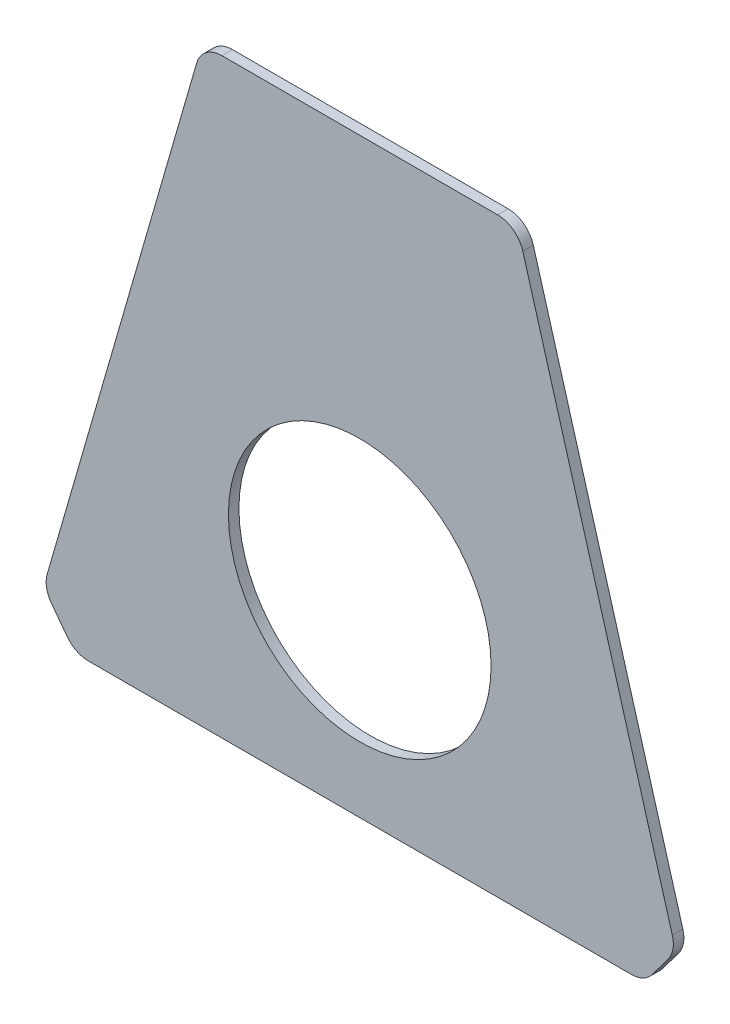
ISO-10303-21;
HEADER;
FILE_DESCRIPTION(('STEP AP214'),'2;1');
FILE_NAME('part.step','',(''),(''),'','','');
FILE_SCHEMA(('AUTOMOTIVE_DESIGN { 1 0 10303 214 1 1 1 1 }'));
ENDSEC;
DATA;
#1=APPLICATION_CONTEXT('core data for automotive mechanical design processes');
#2=APPLICATION_PROTOCOL_DEFINITION('international standard','automotive_design',2000,#1);
#3=PRODUCT_CONTEXT('',#1,'mechanical');
#4=PRODUCT('Part','Part','',(#3));
#5=PRODUCT_RELATED_PRODUCT_CATEGORY('part','',(#4));
#6=PRODUCT_DEFINITION_FORMATION('','',#4);
#7=PRODUCT_DEFINITION_CONTEXT('part definition',#1,'design');
#8=PRODUCT_DEFINITION('design','',#6,#7);
#9=PRODUCT_DEFINITION_SHAPE('','',#8);
#10=(LENGTH_UNIT() NAMED_UNIT(*) SI_UNIT(.MILLI.,.METRE.));
#11=(NAMED_UNIT(*) PLANE_ANGLE_UNIT() SI_UNIT($,.RADIAN.));
#12=(NAMED_UNIT(*) SI_UNIT($,.STERADIAN.) SOLID_ANGLE_UNIT());
#13=UNCERTAINTY_MEASURE_WITH_UNIT(LENGTH_MEASURE(1.E-05),#10,'distance_accuracy_value','');
#14=(GEOMETRIC_REPRESENTATION_CONTEXT(3) GLOBAL_UNCERTAINTY_ASSIGNED_CONTEXT((#13)) GLOBAL_UNIT_ASSIGNED_CONTEXT((#10,
#11,#12)) REPRESENTATION_CONTEXT('',''));
#15=CARTESIAN_POINT('',(0.,0.,0.));
#16=DIRECTION('',(0.,0.,1.));
#17=DIRECTION('',(1.,0.,0.));
#18=AXIS2_PLACEMENT_3D('',#15,#16,#17);
#19=CARTESIAN_POINT('',(-30.5782122406627,-53.0938116022941,1.016));
#20=DIRECTION('',(0.799230771686367,0.601024270383163,0.));
#21=DIRECTION('',(0.,0.,1.));
#22=AXIS2_PLACEMENT_3D('',#19,#20,#21);
#23=PLANE('',#22);
#24=DIRECTION('',(-0.601024270383163,0.799230771686367,0.));
#25=VECTOR('',#24,1.);
#26=CARTESIAN_POINT('',(-30.5782122406627,-53.0938116022941,1.016));
#27=LINE('',#26,#25);
#28=CARTESIAN_POINT('',(-29.8161332173908,-54.1072099555208,1.016));
#29=VERTEX_POINT('',#28);
#30=CARTESIAN_POINT('',(-28.290023733414,-56.1366016467733,1.016));
#31=VERTEX_POINT('',#30);
#32=EDGE_CURVE('E140',#29,#31,#27,.F.);
#33=ORIENTED_EDGE('',*,*,#32,.F.);
#34=DIRECTION('',(0.,0.,1.));
#35=VECTOR('',#34,1.);
#36=CARTESIAN_POINT('',(-29.8161332173908,-54.1072099555208,0.));
#37=LINE('',#36,#35);
#38=CARTESIAN_POINT('',(-29.8161332173908,-54.1072099555208,0.));
#39=VERTEX_POINT('',#38);
#40=EDGE_CURVE('E200',#29,#39,#37,.F.);
#41=ORIENTED_EDGE('',*,*,#40,.T.);
#42=DIRECTION('',(0.601024270383163,-0.799230771686367,0.));
#43=VECTOR('',#42,1.);
#44=CARTESIAN_POINT('',(-45.0364282386178,-33.8675478743966,0.));
#45=LINE('',#44,#43);
#46=CARTESIAN_POINT('',(-28.290023733414,-56.1366016467733,0.));
#47=VERTEX_POINT('',#46);
#48=EDGE_CURVE('E164',#47,#39,#45,.F.);
#49=ORIENTED_EDGE('',*,*,#48,.F.);
#50=DIRECTION('',(0.,0.,-1.));
#51=VECTOR('',#50,1.);
#52=CARTESIAN_POINT('',(-28.290023733414,-56.1366016467733,1.016));
#53=LINE('',#52,#51);
#54=EDGE_CURVE('E198',#47,#31,#53,.F.);
#55=ORIENTED_EDGE('',*,*,#54,.T.);
#56=EDGE_LOOP('',(#33,#41,#49,#55));
#57=FACE_BOUND('',#56,.T.);
#58=ADVANCED_FACE('F43',(#57),#23,.F.);
#59=CARTESIAN_POINT('',(30.5782122406627,-53.0938116022941,1.016));
#60=DIRECTION('',(-0.799230771686367,0.601024270383163,0.));
#61=DIRECTION('',(0.,0.,-1.));
#62=AXIS2_PLACEMENT_3D('',#59,#60,#61);
#63=PLANE('',#62);
#64=DIRECTION('',(-0.601024270383163,-0.799230771686367,0.));
#65=VECTOR('',#64,1.);
#66=CARTESIAN_POINT('',(30.5782122406627,-53.0938116022941,1.016));
#67=LINE('',#66,#65);
#68=CARTESIAN_POINT('',(28.290023733414,-56.1366016467733,1.016));
#69=VERTEX_POINT('',#68);
#70=CARTESIAN_POINT('',(29.8161332173908,-54.1072099555208,1.016));
#71=VERTEX_POINT('',#70);
#72=EDGE_CURVE('E216',#69,#71,#67,.F.);
#73=ORIENTED_EDGE('',*,*,#72,.F.);
#74=DIRECTION('',(0.,0.,1.));
#75=VECTOR('',#74,1.);
#76=CARTESIAN_POINT('',(28.290023733414,-56.1366016467733,0.));
#77=LINE('',#76,#75);
#78=CARTESIAN_POINT('',(28.290023733414,-56.1366016467733,0.));
#79=VERTEX_POINT('',#78);
#80=EDGE_CURVE('E177',#69,#79,#77,.F.);
#81=ORIENTED_EDGE('',*,*,#80,.T.);
#82=DIRECTION('',(0.601024270383163,0.799230771686367,0.));
#83=VECTOR('',#82,1.);
#84=CARTESIAN_POINT('',(45.0364282386178,-33.8675478743966,0.));
#85=LINE('',#84,#83);
#86=CARTESIAN_POINT('',(29.8161332173908,-54.1072099555208,0.));
#87=VERTEX_POINT('',#86);
#88=EDGE_CURVE('E243',#87,#79,#85,.F.);
#89=ORIENTED_EDGE('',*,*,#88,.F.);
#90=DIRECTION('',(0.,0.,-1.));
#91=VECTOR('',#90,1.);
#92=CARTESIAN_POINT('',(29.8161332173908,-54.1072099555208,1.016));
#93=LINE('',#92,#91);
#94=EDGE_CURVE('E175',#87,#71,#93,.F.);
#95=ORIENTED_EDGE('',*,*,#94,.T.);
#96=EDGE_LOOP('',(#73,#81,#89,#95));
#97=FACE_BOUND('',#96,.T.);
#98=ADVANCED_FACE('F262',(#97),#63,.F.);
#99=CARTESIAN_POINT('',(-15.24,0.,1.016));
#100=DIRECTION('',(0.960714182841142,-0.277539652820774,0.));
#101=DIRECTION('',(0.277539652820774,0.960714182841142,0.));
#102=AXIS2_PLACEMENT_3D('',#99,#100,#101);
#103=PLANE('',#102);
#104=DIRECTION('',(-0.277539652820774,-0.960714182841142,0.));
#105=VECTOR('',#104,1.);
#106=CARTESIAN_POINT('',(-15.24,0.,0.));
#107=LINE('',#106,#105);
#108=CARTESIAN_POINT('',(-15.7701253480857,-1.83504928183523,0.));
#109=VERTEX_POINT('',#108);
#110=CARTESIAN_POINT('',(-30.2263010817239,-51.8756575905828,0.));
#111=VERTEX_POINT('',#110);
#112=EDGE_CURVE('E223',#109,#111,#107,.T.);
#113=ORIENTED_EDGE('',*,*,#112,.T.);
#114=DIRECTION('',(0.,0.,-1.));
#115=VECTOR('',#114,1.);
#116=CARTESIAN_POINT('',(-30.2263010817239,-51.8756575905828,1.016));
#117=LINE('',#116,#115);
#118=CARTESIAN_POINT('',(-30.2263010817239,-51.8756575905828,1.016));
#119=VERTEX_POINT('',#118);
#120=EDGE_CURVE('E195',#111,#119,#117,.F.);
#121=ORIENTED_EDGE('',*,*,#120,.T.);
#122=DIRECTION('',(-0.277539652820774,-0.960714182841142,0.));
#123=VECTOR('',#122,1.);
#124=CARTESIAN_POINT('',(-15.24,0.,1.016));
#125=LINE('',#124,#123);
#126=CARTESIAN_POINT('',(-15.7701253480857,-1.83504928183523,1.016));
#127=VERTEX_POINT('',#126);
#128=EDGE_CURVE('E157',#127,#119,#125,.T.);
#129=ORIENTED_EDGE('',*,*,#128,.F.);
#130=DIRECTION('',(0.,0.,-1.));
#131=VECTOR('',#130,1.);
#132=CARTESIAN_POINT('',(-15.7701253480857,-1.83504928183523,1.016));
#133=LINE('',#132,#131);
#134=EDGE_CURVE('E192',#127,#109,#133,.T.);
#135=ORIENTED_EDGE('',*,*,#134,.T.);
#136=EDGE_LOOP('',(#113,#121,#129,#135));
#137=FACE_BOUND('',#136,.T.);
#138=ADVANCED_FACE('F222',(#137),#103,.F.);
#139=CARTESIAN_POINT('',(31.75,-57.15,1.016));
#140=DIRECTION('',(0.,1.,0.));
#141=DIRECTION('',(0.,0.,1.));
#142=AXIS2_PLACEMENT_3D('',#139,#140,#141);
#143=PLANE('',#142);
#144=DIRECTION('',(1.,0.,0.));
#145=VECTOR('',#144,1.);
#146=CARTESIAN_POINT('',(31.75,-57.15,0.));
#147=LINE('',#146,#145);
#148=CARTESIAN_POINT('',(-26.2599775733307,-57.15,0.));
#149=VERTEX_POINT('',#148);
#150=CARTESIAN_POINT('',(26.2599775733307,-57.15,0.));
#151=VERTEX_POINT('',#150);
#152=EDGE_CURVE('E229',#149,#151,#147,.T.);
#153=ORIENTED_EDGE('',*,*,#152,.T.);
#154=DIRECTION('',(0.,0.,-1.));
#155=VECTOR('',#154,1.);
#156=CARTESIAN_POINT('',(26.2599775733307,-57.15,1.016));
#157=LINE('',#156,#155);
#158=CARTESIAN_POINT('',(26.2599775733307,-57.15,1.016));
#159=VERTEX_POINT('',#158);
#160=EDGE_CURVE('E155',#151,#159,#157,.F.);
#161=ORIENTED_EDGE('',*,*,#160,.T.);
#162=DIRECTION('',(1.,0.,0.));
#163=VECTOR('',#162,1.);
#164=CARTESIAN_POINT('',(31.75,-57.15,1.016));
#165=LINE('',#164,#163);
#166=CARTESIAN_POINT('',(-26.2599775733307,-57.15,1.016));
#167=VERTEX_POINT('',#166);
#168=EDGE_CURVE('E138',#167,#159,#165,.T.);
#169=ORIENTED_EDGE('',*,*,#168,.F.);
#170=DIRECTION('',(0.,0.,1.));
#171=VECTOR('',#170,1.);
#172=CARTESIAN_POINT('',(-26.2599775733307,-57.15,0.));
#173=LINE('',#172,#171);
#174=EDGE_CURVE('E152',#167,#149,#173,.F.);
#175=ORIENTED_EDGE('',*,*,#174,.T.);
#176=EDGE_LOOP('',(#153,#161,#169,#175));
#177=FACE_BOUND('',#176,.T.);
#178=ADVANCED_FACE('F151',(#177),#143,.F.);
#179=CARTESIAN_POINT('',(15.24,0.,1.016));
#180=DIRECTION('',(-0.960714182841142,-0.277539652820774,0.));
#181=DIRECTION('',(0.277539652820774,-0.960714182841142,0.));
#182=AXIS2_PLACEMENT_3D('',#179,#180,#181);
#183=PLANE('',#182);
#184=DIRECTION('',(-0.277539652820774,0.960714182841142,0.));
#185=VECTOR('',#184,1.);
#186=CARTESIAN_POINT('',(15.24,0.,1.016));
#187=LINE('',#186,#185);
#188=CARTESIAN_POINT('',(30.2263010817239,-51.8756575905828,1.016));
#189=VERTEX_POINT('',#188);
#190=CARTESIAN_POINT('',(15.7701253480857,-1.83504928183523,1.016));
#191=VERTEX_POINT('',#190);
#192=EDGE_CURVE('E156',#189,#191,#187,.T.);
#193=ORIENTED_EDGE('',*,*,#192,.F.);
#194=DIRECTION('',(0.,0.,1.));
#195=VECTOR('',#194,1.);
#196=CARTESIAN_POINT('',(30.2263010817239,-51.8756575905828,0.));
#197=LINE('',#196,#195);
#198=CARTESIAN_POINT('',(30.2263010817239,-51.8756575905828,0.));
#199=VERTEX_POINT('',#198);
#200=EDGE_CURVE('E190',#189,#199,#197,.F.);
#201=ORIENTED_EDGE('',*,*,#200,.T.);
#202=DIRECTION('',(-0.277539652820774,0.960714182841142,0.));
#203=VECTOR('',#202,1.);
#204=CARTESIAN_POINT('',(15.24,0.,0.));
#205=LINE('',#204,#203);
#206=CARTESIAN_POINT('',(15.7701253480857,-1.83504928183523,0.));
#207=VERTEX_POINT('',#206);
#208=EDGE_CURVE('E232',#199,#207,#205,.T.);
#209=ORIENTED_EDGE('',*,*,#208,.T.);
#210=DIRECTION('',(0.,0.,-1.));
#211=VECTOR('',#210,1.);
#212=CARTESIAN_POINT('',(15.7701253480857,-1.83504928183523,1.016));
#213=LINE('',#212,#211);
#214=EDGE_CURVE('E188',#207,#191,#213,.F.);
#215=ORIENTED_EDGE('',*,*,#214,.T.);
#216=EDGE_LOOP('',(#193,#201,#209,#215));
#217=FACE_BOUND('',#216,.T.);
#218=ADVANCED_FACE('F257',(#217),#183,.F.);
#219=CARTESIAN_POINT('',(-15.24,0.,1.016));
#220=DIRECTION('',(0.,-1.,0.));
#221=DIRECTION('',(0.,0.,-1.));
#222=AXIS2_PLACEMENT_3D('',#219,#220,#221);
#223=PLANE('',#222);
#224=DIRECTION('',(-1.,0.,0.));
#225=VECTOR('',#224,1.);
#226=CARTESIAN_POINT('',(-15.24,0.,1.016));
#227=LINE('',#226,#225);
#228=CARTESIAN_POINT('',(13.3299113236692,0.,1.016));
#229=VERTEX_POINT('',#228);
#230=CARTESIAN_POINT('',(-13.3299113236692,0.,1.016));
#231=VERTEX_POINT('',#230);
#232=EDGE_CURVE('E207',#229,#231,#227,.T.);
#233=ORIENTED_EDGE('',*,*,#232,.F.);
#234=DIRECTION('',(0.,0.,-1.));
#235=VECTOR('',#234,1.);
#236=CARTESIAN_POINT('',(13.3299113236692,0.,1.016));
#237=LINE('',#236,#235);
#238=CARTESIAN_POINT('',(13.3299113236692,0.,0.));
#239=VERTEX_POINT('',#238);
#240=EDGE_CURVE('E13',#229,#239,#237,.T.);
#241=ORIENTED_EDGE('',*,*,#240,.T.);
#242=DIRECTION('',(-1.,0.,0.));
#243=VECTOR('',#242,1.);
#244=CARTESIAN_POINT('',(-15.24,0.,0.));
#245=LINE('',#244,#243);
#246=CARTESIAN_POINT('',(-13.3299113236692,0.,0.));
#247=VERTEX_POINT('',#246);
#248=EDGE_CURVE('E209',#239,#247,#245,.T.);
#249=ORIENTED_EDGE('',*,*,#248,.T.);
#250=DIRECTION('',(0.,0.,-1.));
#251=VECTOR('',#250,1.);
#252=CARTESIAN_POINT('',(-13.3299113236692,0.,1.016));
#253=LINE('',#252,#251);
#254=EDGE_CURVE('E51',#247,#231,#253,.F.);
#255=ORIENTED_EDGE('',*,*,#254,.T.);
#256=EDGE_LOOP('',(#233,#241,#249,#255));
#257=FACE_BOUND('',#256,.T.);
#258=ADVANCED_FACE('F206',(#257),#223,.F.);
#259=CARTESIAN_POINT('',(0.,0.,1.016));
#260=DIRECTION('',(0.,0.,-1.));
#261=DIRECTION('',(-1.,0.,0.));
#262=AXIS2_PLACEMENT_3D('',#259,#260,#261);
#263=PLANE('',#262);
#264=CARTESIAN_POINT('',(0.,-38.1,1.016));
#265=DIRECTION('',(0.,0.,1.));
#266=DIRECTION('',(1.,0.,0.));
#267=AXIS2_PLACEMENT_3D('',#264,#265,#266);
#268=CIRCLE('',#267,12.7);
#269=CARTESIAN_POINT('',(12.7,-38.1,1.016));
#270=VERTEX_POINT('',#269);
#271=EDGE_CURVE('E235',#270,#270,#268,.T.);
#272=ORIENTED_EDGE('',*,*,#271,.F.);
#273=EDGE_LOOP('',(#272));
#274=FACE_BOUND('',#273,.T.);
#275=ORIENTED_EDGE('',*,*,#168,.T.);
#276=CARTESIAN_POINT('',(26.2599775733307,-54.61,1.016));
#277=DIRECTION('',(0.,0.,-1.));
#278=DIRECTION('',(-1.,0.,0.));
#279=AXIS2_PLACEMENT_3D('',#276,#277,#278);
#280=CIRCLE('',#279,2.54);
#281=EDGE_CURVE('E173',#159,#69,#280,.F.);
#282=ORIENTED_EDGE('',*,*,#281,.T.);
#283=ORIENTED_EDGE('',*,*,#72,.T.);
#284=CARTESIAN_POINT('',(27.7860870573074,-52.5806083087476,1.016));
#285=DIRECTION('',(0.,0.,-1.));
#286=DIRECTION('',(-1.,0.,0.));
#287=AXIS2_PLACEMENT_3D('',#284,#285,#286);
#288=CIRCLE('',#287,2.54);
#289=EDGE_CURVE('E171',#71,#189,#288,.F.);
#290=ORIENTED_EDGE('',*,*,#289,.T.);
#291=ORIENTED_EDGE('',*,*,#192,.T.);
#292=CARTESIAN_POINT('',(13.3299113236692,-2.54,1.016));
#293=DIRECTION('',(0.,0.,-1.));
#294=DIRECTION('',(-1.,0.,0.));
#295=AXIS2_PLACEMENT_3D('',#292,#293,#294);
#296=CIRCLE('',#295,2.54);
#297=EDGE_CURVE('E145',#191,#229,#296,.F.);
#298=ORIENTED_EDGE('',*,*,#297,.T.);
#299=ORIENTED_EDGE('',*,*,#232,.T.);
#300=CARTESIAN_POINT('',(-13.3299113236692,-2.54,1.016));
#301=DIRECTION('',(0.,0.,-1.));
#302=DIRECTION('',(-1.,0.,0.));
#303=AXIS2_PLACEMENT_3D('',#300,#301,#302);
#304=CIRCLE('',#303,2.54);
#305=EDGE_CURVE('E162',#231,#127,#304,.F.);
#306=ORIENTED_EDGE('',*,*,#305,.T.);
#307=ORIENTED_EDGE('',*,*,#128,.T.);
#308=CARTESIAN_POINT('',(-27.7860870573074,-52.5806083087476,1.016));
#309=DIRECTION('',(0.,0.,-1.));
#310=DIRECTION('',(-1.,0.,0.));
#311=AXIS2_PLACEMENT_3D('',#308,#309,#310);
#312=CIRCLE('',#311,2.54);
#313=EDGE_CURVE('E144',#119,#29,#312,.F.);
#314=ORIENTED_EDGE('',*,*,#313,.T.);
#315=ORIENTED_EDGE('',*,*,#32,.T.);
#316=CARTESIAN_POINT('',(-26.2599775733307,-54.61,1.016));
#317=DIRECTION('',(0.,0.,-1.));
#318=DIRECTION('',(-1.,0.,0.));
#319=AXIS2_PLACEMENT_3D('',#316,#317,#318);
#320=CIRCLE('',#319,2.54);
#321=EDGE_CURVE('E135',#31,#167,#320,.F.);
#322=ORIENTED_EDGE('',*,*,#321,.T.);
#323=EDGE_LOOP('',(#275,#282,#283,#290,#291,#298,#299,#306,#307,#314,#315,#322));
#324=FACE_BOUND('',#323,.T.);
#325=ADVANCED_FACE('F137',(#274,#324),#263,.F.);
#326=CARTESIAN_POINT('',(0.,0.,0.));
#327=DIRECTION('',(0.,0.,-1.));
#328=DIRECTION('',(-1.,0.,0.));
#329=AXIS2_PLACEMENT_3D('',#326,#327,#328);
#330=PLANE('',#329);
#331=CARTESIAN_POINT('',(0.,-38.1,0.));
#332=DIRECTION('',(0.,0.,-1.));
#333=DIRECTION('',(-1.,0.,0.));
#334=AXIS2_PLACEMENT_3D('',#331,#332,#333);
#335=CIRCLE('',#334,12.7);
#336=CARTESIAN_POINT('',(-12.7,-38.1,0.));
#337=VERTEX_POINT('',#336);
#338=EDGE_CURVE('E230',#337,#337,#335,.T.);
#339=ORIENTED_EDGE('',*,*,#338,.F.);
#340=EDGE_LOOP('',(#339));
#341=FACE_BOUND('',#340,.T.);
#342=ORIENTED_EDGE('',*,*,#88,.T.);
#343=CARTESIAN_POINT('',(26.2599775733307,-54.61,0.));
#344=DIRECTION('',(0.,0.,-1.));
#345=DIRECTION('',(-1.,0.,0.));
#346=AXIS2_PLACEMENT_3D('',#343,#344,#345);
#347=CIRCLE('',#346,2.54);
#348=EDGE_CURVE('E186',#79,#151,#347,.T.);
#349=ORIENTED_EDGE('',*,*,#348,.T.);
#350=ORIENTED_EDGE('',*,*,#152,.F.);
#351=CARTESIAN_POINT('',(-26.2599775733307,-54.61,0.));
#352=DIRECTION('',(0.,0.,-1.));
#353=DIRECTION('',(-1.,0.,0.));
#354=AXIS2_PLACEMENT_3D('',#351,#352,#353);
#355=CIRCLE('',#354,2.54);
#356=EDGE_CURVE('E160',#149,#47,#355,.T.);
#357=ORIENTED_EDGE('',*,*,#356,.T.);
#358=ORIENTED_EDGE('',*,*,#48,.T.);
#359=CARTESIAN_POINT('',(-27.7860870573074,-52.5806083087476,0.));
#360=DIRECTION('',(0.,0.,-1.));
#361=DIRECTION('',(-1.,0.,0.));
#362=AXIS2_PLACEMENT_3D('',#359,#360,#361);
#363=CIRCLE('',#362,2.54);
#364=EDGE_CURVE('E183',#39,#111,#363,.T.);
#365=ORIENTED_EDGE('',*,*,#364,.T.);
#366=ORIENTED_EDGE('',*,*,#112,.F.);
#367=CARTESIAN_POINT('',(-13.3299113236692,-2.54,0.));
#368=DIRECTION('',(0.,0.,-1.));
#369=DIRECTION('',(-1.,0.,0.));
#370=AXIS2_PLACEMENT_3D('',#367,#368,#369);
#371=CIRCLE('',#370,2.54);
#372=EDGE_CURVE('E179',#109,#247,#371,.T.);
#373=ORIENTED_EDGE('',*,*,#372,.T.);
#374=ORIENTED_EDGE('',*,*,#248,.F.);
#375=CARTESIAN_POINT('',(13.3299113236692,-2.54,0.));
#376=DIRECTION('',(0.,0.,-1.));
#377=DIRECTION('',(-1.,0.,0.));
#378=AXIS2_PLACEMENT_3D('',#375,#376,#377);
#379=CIRCLE('',#378,2.54);
#380=EDGE_CURVE('E58',#239,#207,#379,.T.);
#381=ORIENTED_EDGE('',*,*,#380,.T.);
#382=ORIENTED_EDGE('',*,*,#208,.F.);
#383=CARTESIAN_POINT('',(27.7860870573074,-52.5806083087476,0.));
#384=DIRECTION('',(0.,0.,-1.));
#385=DIRECTION('',(-1.,0.,0.));
#386=AXIS2_PLACEMENT_3D('',#383,#384,#385);
#387=CIRCLE('',#386,2.54);
#388=EDGE_CURVE('E66',#199,#87,#387,.T.);
#389=ORIENTED_EDGE('',*,*,#388,.T.);
#390=EDGE_LOOP('',(#342,#349,#350,#357,#358,#365,#366,#373,#374,#381,#382,#389));
#391=FACE_BOUND('',#390,.T.);
#392=ADVANCED_FACE('F226',(#341,#391),#330,.T.);
#393=CARTESIAN_POINT('',(0.,-38.1,1.016));
#394=DIRECTION('',(0.,0.,1.));
#395=DIRECTION('',(1.,0.,0.));
#396=AXIS2_PLACEMENT_3D('',#393,#394,#395);
#397=CYLINDRICAL_SURFACE('',#396,12.7);
#398=ORIENTED_EDGE('',*,*,#271,.T.);
#399=EDGE_LOOP('',(#398));
#400=FACE_BOUND('',#399,.T.);
#401=ORIENTED_EDGE('',*,*,#338,.T.);
#402=EDGE_LOOP('',(#401));
#403=FACE_BOUND('',#402,.T.);
#404=ADVANCED_FACE('F273',(#400,#403),#397,.F.);
#405=CARTESIAN_POINT('',(26.2599775733307,-54.61,1.016));
#406=DIRECTION('',(0.,0.,1.));
#407=DIRECTION('',(1.,0.,0.));
#408=AXIS2_PLACEMENT_3D('',#405,#406,#407);
#409=CYLINDRICAL_SURFACE('',#408,2.54);
#410=ORIENTED_EDGE('',*,*,#348,.F.);
#411=ORIENTED_EDGE('',*,*,#80,.F.);
#412=ORIENTED_EDGE('',*,*,#281,.F.);
#413=ORIENTED_EDGE('',*,*,#160,.F.);
#414=EDGE_LOOP('',(#410,#411,#412,#413));
#415=FACE_BOUND('',#414,.T.);
#416=ADVANCED_FACE('F266',(#415),#409,.T.);
#417=CARTESIAN_POINT('',(27.7860870573074,-52.5806083087476,1.016));
#418=DIRECTION('',(0.,0.,-1.));
#419=DIRECTION('',(-1.,0.,0.));
#420=AXIS2_PLACEMENT_3D('',#417,#418,#419);
#421=CYLINDRICAL_SURFACE('',#420,2.54);
#422=ORIENTED_EDGE('',*,*,#289,.F.);
#423=ORIENTED_EDGE('',*,*,#94,.F.);
#424=ORIENTED_EDGE('',*,*,#388,.F.);
#425=ORIENTED_EDGE('',*,*,#200,.F.);
#426=EDGE_LOOP('',(#422,#423,#424,#425));
#427=FACE_BOUND('',#426,.T.);
#428=ADVANCED_FACE('F264',(#427),#421,.T.);
#429=CARTESIAN_POINT('',(-27.7860870573074,-52.5806083087476,1.016));
#430=DIRECTION('',(0.,0.,1.));
#431=DIRECTION('',(1.,0.,0.));
#432=AXIS2_PLACEMENT_3D('',#429,#430,#431);
#433=CYLINDRICAL_SURFACE('',#432,2.54);
#434=ORIENTED_EDGE('',*,*,#364,.F.);
#435=ORIENTED_EDGE('',*,*,#40,.F.);
#436=ORIENTED_EDGE('',*,*,#313,.F.);
#437=ORIENTED_EDGE('',*,*,#120,.F.);
#438=EDGE_LOOP('',(#434,#435,#436,#437));
#439=FACE_BOUND('',#438,.T.);
#440=ADVANCED_FACE('F248',(#439),#433,.T.);
#441=CARTESIAN_POINT('',(-26.2599775733307,-54.61,1.016));
#442=DIRECTION('',(0.,0.,-1.));
#443=DIRECTION('',(-1.,0.,0.));
#444=AXIS2_PLACEMENT_3D('',#441,#442,#443);
#445=CYLINDRICAL_SURFACE('',#444,2.54);
#446=ORIENTED_EDGE('',*,*,#321,.F.);
#447=ORIENTED_EDGE('',*,*,#54,.F.);
#448=ORIENTED_EDGE('',*,*,#356,.F.);
#449=ORIENTED_EDGE('',*,*,#174,.F.);
#450=EDGE_LOOP('',(#446,#447,#448,#449));
#451=FACE_BOUND('',#450,.T.);
#452=ADVANCED_FACE('F159',(#451),#445,.T.);
#453=CARTESIAN_POINT('',(13.3299113236692,-2.54,1.016));
#454=DIRECTION('',(0.,0.,-1.));
#455=DIRECTION('',(-1.,0.,0.));
#456=AXIS2_PLACEMENT_3D('',#453,#454,#455);
#457=CYLINDRICAL_SURFACE('',#456,2.54);
#458=ORIENTED_EDGE('',*,*,#297,.F.);
#459=ORIENTED_EDGE('',*,*,#214,.F.);
#460=ORIENTED_EDGE('',*,*,#380,.F.);
#461=ORIENTED_EDGE('',*,*,#240,.F.);
#462=EDGE_LOOP('',(#458,#459,#460,#461));
#463=FACE_BOUND('',#462,.T.);
#464=ADVANCED_FACE('F256',(#463),#457,.T.);
#465=CARTESIAN_POINT('',(-13.3299113236692,-2.54,1.016));
#466=DIRECTION('',(0.,0.,-1.));
#467=DIRECTION('',(-1.,0.,0.));
#468=AXIS2_PLACEMENT_3D('',#465,#466,#467);
#469=CYLINDRICAL_SURFACE('',#468,2.54);
#470=ORIENTED_EDGE('',*,*,#305,.F.);
#471=ORIENTED_EDGE('',*,*,#254,.F.);
#472=ORIENTED_EDGE('',*,*,#372,.F.);
#473=ORIENTED_EDGE('',*,*,#134,.F.);
#474=EDGE_LOOP('',(#470,#471,#472,#473));
#475=FACE_BOUND('',#474,.T.);
#476=ADVANCED_FACE('F45',(#475),#469,.T.);
#477=CLOSED_SHELL('',(#58,#98,#138,#178,#218,#258,#325,#392,#404,#416,#428,#440,#452,#464,#476));
#478=MANIFOLD_SOLID_BREP('B2',#477);
#479=ADVANCED_BREP_SHAPE_REPRESENTATION('',(#18,#478),#14);
#480=SHAPE_DEFINITION_REPRESENTATION(#9,#479);
ENDSEC;
END-ISO-10303-21;
